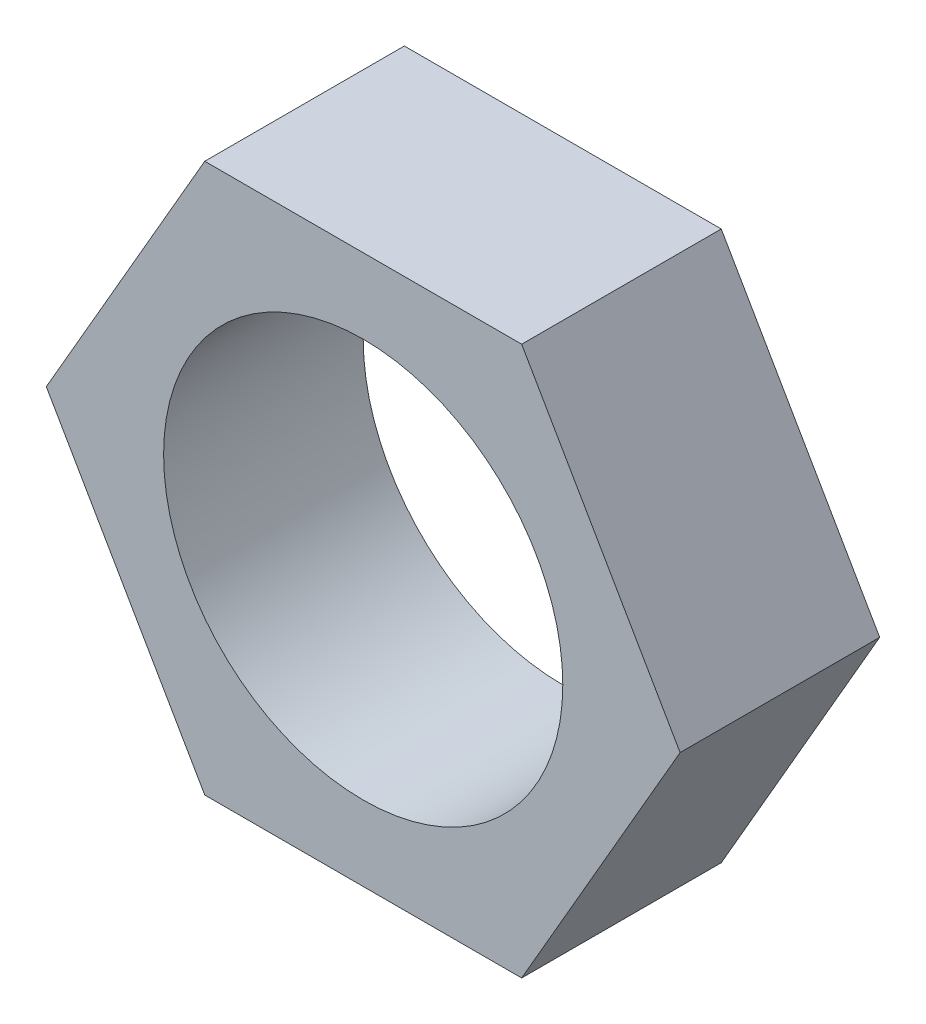
ISO-10303-21;
HEADER;
FILE_DESCRIPTION(('STEP AP214'),'2;1');
FILE_NAME('part.step','',(''),(''),'','','');
FILE_SCHEMA(('AUTOMOTIVE_DESIGN { 1 0 10303 214 1 1 1 1 }'));
ENDSEC;
DATA;
#1=APPLICATION_CONTEXT('core data for automotive mechanical design processes');
#2=APPLICATION_PROTOCOL_DEFINITION('international standard','automotive_design',2000,#1);
#3=PRODUCT_CONTEXT('',#1,'mechanical');
#4=PRODUCT('Part','Part','',(#3));
#5=PRODUCT_RELATED_PRODUCT_CATEGORY('part','',(#4));
#6=PRODUCT_DEFINITION_FORMATION('','',#4);
#7=PRODUCT_DEFINITION_CONTEXT('part definition',#1,'design');
#8=PRODUCT_DEFINITION('design','',#6,#7);
#9=PRODUCT_DEFINITION_SHAPE('','',#8);
#10=(LENGTH_UNIT() NAMED_UNIT(*) SI_UNIT(.MILLI.,.METRE.));
#11=(NAMED_UNIT(*) PLANE_ANGLE_UNIT() SI_UNIT($,.RADIAN.));
#12=(NAMED_UNIT(*) SI_UNIT($,.STERADIAN.) SOLID_ANGLE_UNIT());
#13=UNCERTAINTY_MEASURE_WITH_UNIT(LENGTH_MEASURE(1.E-05),#10,'distance_accuracy_value','');
#14=(GEOMETRIC_REPRESENTATION_CONTEXT(3) GLOBAL_UNCERTAINTY_ASSIGNED_CONTEXT((#13)) GLOBAL_UNIT_ASSIGNED_CONTEXT((#10,
#11,#12)) REPRESENTATION_CONTEXT('',''));
#15=CARTESIAN_POINT('',(0.,0.,0.));
#16=DIRECTION('',(0.,0.,1.));
#17=DIRECTION('',(1.,0.,0.));
#18=AXIS2_PLACEMENT_3D('',#15,#16,#17);
#19=CARTESIAN_POINT('',(4.03279163028953,-6.985,5.08));
#20=DIRECTION('',(-0.866025403784439,0.5,0.));
#21=DIRECTION('',(-0.5,-0.866025403784439,0.));
#22=AXIS2_PLACEMENT_3D('',#19,#20,#21);
#23=PLANE('',#22);
#24=DIRECTION('',(0.5,0.866025403784439,0.));
#25=VECTOR('',#24,1.);
#26=CARTESIAN_POINT('',(4.03279163028953,-6.985,0.));
#27=LINE('',#26,#25);
#28=CARTESIAN_POINT('',(4.03279163028953,-6.985,0.));
#29=VERTEX_POINT('',#28);
#30=CARTESIAN_POINT('',(8.06558326057907,0.,0.));
#31=VERTEX_POINT('',#30);
#32=EDGE_CURVE('E125',#29,#31,#27,.T.);
#33=ORIENTED_EDGE('',*,*,#32,.T.);
#34=DIRECTION('',(0.,0.,-1.));
#35=VECTOR('',#34,1.);
#36=CARTESIAN_POINT('',(8.06558326057907,0.,5.08));
#37=LINE('',#36,#35);
#38=CARTESIAN_POINT('',(8.06558326057907,0.,5.08));
#39=VERTEX_POINT('',#38);
#40=EDGE_CURVE('E11',#39,#31,#37,.T.);
#41=ORIENTED_EDGE('',*,*,#40,.F.);
#42=DIRECTION('',(0.5,0.866025403784439,0.));
#43=VECTOR('',#42,1.);
#44=CARTESIAN_POINT('',(4.03279163028953,-6.985,5.08));
#45=LINE('',#44,#43);
#46=CARTESIAN_POINT('',(4.03279163028953,-6.985,5.08));
#47=VERTEX_POINT('',#46);
#48=EDGE_CURVE('E136',#47,#39,#45,.T.);
#49=ORIENTED_EDGE('',*,*,#48,.F.);
#50=DIRECTION('',(0.,0.,-1.));
#51=VECTOR('',#50,1.);
#52=CARTESIAN_POINT('',(4.03279163028953,-6.985,5.08));
#53=LINE('',#52,#51);
#54=EDGE_CURVE('E121',#47,#29,#53,.T.);
#55=ORIENTED_EDGE('',*,*,#54,.T.);
#56=EDGE_LOOP('',(#33,#41,#49,#55));
#57=FACE_BOUND('',#56,.T.);
#58=ADVANCED_FACE('F41',(#57),#23,.F.);
#59=CARTESIAN_POINT('',(8.06558326057907,0.,5.08));
#60=DIRECTION('',(-0.866025403784439,-0.5,0.));
#61=DIRECTION('',(0.5,-0.866025403784439,0.));
#62=AXIS2_PLACEMENT_3D('',#59,#60,#61);
#63=PLANE('',#62);
#64=DIRECTION('',(-0.5,0.866025403784439,0.));
#65=VECTOR('',#64,1.);
#66=CARTESIAN_POINT('',(8.06558326057907,0.,0.));
#67=LINE('',#66,#65);
#68=CARTESIAN_POINT('',(4.03279163028954,6.985,0.));
#69=VERTEX_POINT('',#68);
#70=EDGE_CURVE('E128',#31,#69,#67,.T.);
#71=ORIENTED_EDGE('',*,*,#70,.T.);
#72=DIRECTION('',(0.,0.,-1.));
#73=VECTOR('',#72,1.);
#74=CARTESIAN_POINT('',(4.03279163028954,6.985,5.08));
#75=LINE('',#74,#73);
#76=CARTESIAN_POINT('',(4.03279163028954,6.985,5.08));
#77=VERTEX_POINT('',#76);
#78=EDGE_CURVE('E49',#77,#69,#75,.T.);
#79=ORIENTED_EDGE('',*,*,#78,.F.);
#80=DIRECTION('',(-0.5,0.866025403784439,0.));
#81=VECTOR('',#80,1.);
#82=CARTESIAN_POINT('',(8.06558326057907,0.,5.08));
#83=LINE('',#82,#81);
#84=EDGE_CURVE('E94',#39,#77,#83,.T.);
#85=ORIENTED_EDGE('',*,*,#84,.F.);
#86=ORIENTED_EDGE('',*,*,#40,.T.);
#87=EDGE_LOOP('',(#71,#79,#85,#86));
#88=FACE_BOUND('',#87,.T.);
#89=ADVANCED_FACE('F161',(#88),#63,.F.);
#90=CARTESIAN_POINT('',(4.03279163028954,6.985,5.08));
#91=DIRECTION('',(0.,-1.,0.));
#92=DIRECTION('',(1.,0.,0.));
#93=AXIS2_PLACEMENT_3D('',#90,#91,#92);
#94=PLANE('',#93);
#95=DIRECTION('',(-1.,0.,0.));
#96=VECTOR('',#95,1.);
#97=CARTESIAN_POINT('',(4.03279163028954,6.985,0.));
#98=LINE('',#97,#96);
#99=CARTESIAN_POINT('',(-4.03279163028953,6.985,0.));
#100=VERTEX_POINT('',#99);
#101=EDGE_CURVE('E131',#69,#100,#98,.T.);
#102=ORIENTED_EDGE('',*,*,#101,.T.);
#103=DIRECTION('',(0.,0.,-1.));
#104=VECTOR('',#103,1.);
#105=CARTESIAN_POINT('',(-4.03279163028953,6.985,5.08));
#106=LINE('',#105,#104);
#107=CARTESIAN_POINT('',(-4.03279163028953,6.985,5.08));
#108=VERTEX_POINT('',#107);
#109=EDGE_CURVE('E116',#108,#100,#106,.T.);
#110=ORIENTED_EDGE('',*,*,#109,.F.);
#111=DIRECTION('',(-1.,0.,0.));
#112=VECTOR('',#111,1.);
#113=CARTESIAN_POINT('',(4.03279163028954,6.985,5.08));
#114=LINE('',#113,#112);
#115=EDGE_CURVE('E107',#77,#108,#114,.T.);
#116=ORIENTED_EDGE('',*,*,#115,.F.);
#117=ORIENTED_EDGE('',*,*,#78,.T.);
#118=EDGE_LOOP('',(#102,#110,#116,#117));
#119=FACE_BOUND('',#118,.T.);
#120=ADVANCED_FACE('F142',(#119),#94,.F.);
#121=CARTESIAN_POINT('',(-4.03279163028953,6.985,5.08));
#122=DIRECTION('',(0.866025403784439,-0.5,0.));
#123=DIRECTION('',(0.5,0.866025403784439,0.));
#124=AXIS2_PLACEMENT_3D('',#121,#122,#123);
#125=PLANE('',#124);
#126=DIRECTION('',(-0.5,-0.866025403784439,0.));
#127=VECTOR('',#126,1.);
#128=CARTESIAN_POINT('',(-4.03279163028953,6.985,0.));
#129=LINE('',#128,#127);
#130=CARTESIAN_POINT('',(-8.06558326057907,0.,0.));
#131=VERTEX_POINT('',#130);
#132=EDGE_CURVE('E115',#100,#131,#129,.T.);
#133=ORIENTED_EDGE('',*,*,#132,.T.);
#134=DIRECTION('',(0.,0.,-1.));
#135=VECTOR('',#134,1.);
#136=CARTESIAN_POINT('',(-8.06558326057907,0.,5.08));
#137=LINE('',#136,#135);
#138=CARTESIAN_POINT('',(-8.06558326057907,0.,5.08));
#139=VERTEX_POINT('',#138);
#140=EDGE_CURVE('E112',#139,#131,#137,.T.);
#141=ORIENTED_EDGE('',*,*,#140,.F.);
#142=DIRECTION('',(-0.5,-0.866025403784439,0.));
#143=VECTOR('',#142,1.);
#144=CARTESIAN_POINT('',(-4.03279163028953,6.985,5.08));
#145=LINE('',#144,#143);
#146=EDGE_CURVE('E101',#108,#139,#145,.T.);
#147=ORIENTED_EDGE('',*,*,#146,.F.);
#148=ORIENTED_EDGE('',*,*,#109,.T.);
#149=EDGE_LOOP('',(#133,#141,#147,#148));
#150=FACE_BOUND('',#149,.T.);
#151=ADVANCED_FACE('F113',(#150),#125,.F.);
#152=CARTESIAN_POINT('',(-8.06558326057907,0.,5.08));
#153=DIRECTION('',(0.866025403784439,0.5,0.));
#154=DIRECTION('',(-0.5,0.866025403784439,0.));
#155=AXIS2_PLACEMENT_3D('',#152,#153,#154);
#156=PLANE('',#155);
#157=DIRECTION('',(0.5,-0.866025403784439,0.));
#158=VECTOR('',#157,1.);
#159=CARTESIAN_POINT('',(-8.06558326057907,0.,0.));
#160=LINE('',#159,#158);
#161=CARTESIAN_POINT('',(-4.03279163028954,-6.985,0.));
#162=VERTEX_POINT('',#161);
#163=EDGE_CURVE('E80',#131,#162,#160,.T.);
#164=ORIENTED_EDGE('',*,*,#163,.T.);
#165=DIRECTION('',(0.,0.,-1.));
#166=VECTOR('',#165,1.);
#167=CARTESIAN_POINT('',(-4.03279163028954,-6.985,5.08));
#168=LINE('',#167,#166);
#169=CARTESIAN_POINT('',(-4.03279163028954,-6.985,5.08));
#170=VERTEX_POINT('',#169);
#171=EDGE_CURVE('E117',#170,#162,#168,.T.);
#172=ORIENTED_EDGE('',*,*,#171,.F.);
#173=DIRECTION('',(0.5,-0.866025403784439,0.));
#174=VECTOR('',#173,1.);
#175=CARTESIAN_POINT('',(-8.06558326057907,0.,5.08));
#176=LINE('',#175,#174);
#177=EDGE_CURVE('E105',#139,#170,#176,.T.);
#178=ORIENTED_EDGE('',*,*,#177,.F.);
#179=ORIENTED_EDGE('',*,*,#140,.T.);
#180=EDGE_LOOP('',(#164,#172,#178,#179));
#181=FACE_BOUND('',#180,.T.);
#182=ADVANCED_FACE('F119',(#181),#156,.F.);
#183=CARTESIAN_POINT('',(-4.03279163028954,-6.985,5.08));
#184=DIRECTION('',(0.,1.,0.));
#185=DIRECTION('',(-1.,0.,0.));
#186=AXIS2_PLACEMENT_3D('',#183,#184,#185);
#187=PLANE('',#186);
#188=DIRECTION('',(1.,0.,0.));
#189=VECTOR('',#188,1.);
#190=CARTESIAN_POINT('',(-4.03279163028954,-6.985,0.));
#191=LINE('',#190,#189);
#192=EDGE_CURVE('E86',#162,#29,#191,.T.);
#193=ORIENTED_EDGE('',*,*,#192,.T.);
#194=ORIENTED_EDGE('',*,*,#54,.F.);
#195=DIRECTION('',(1.,0.,0.));
#196=VECTOR('',#195,1.);
#197=CARTESIAN_POINT('',(-4.03279163028954,-6.985,5.08));
#198=LINE('',#197,#196);
#199=EDGE_CURVE('E57',#170,#47,#198,.T.);
#200=ORIENTED_EDGE('',*,*,#199,.F.);
#201=ORIENTED_EDGE('',*,*,#171,.T.);
#202=EDGE_LOOP('',(#193,#194,#200,#201));
#203=FACE_BOUND('',#202,.T.);
#204=ADVANCED_FACE('F149',(#203),#187,.F.);
#205=CARTESIAN_POINT('',(0.,0.,5.08));
#206=DIRECTION('',(0.,0.,1.));
#207=DIRECTION('',(1.,0.,0.));
#208=AXIS2_PLACEMENT_3D('',#205,#206,#207);
#209=PLANE('',#208);
#210=CARTESIAN_POINT('',(0.,0.,5.08));
#211=DIRECTION('',(0.,0.,1.));
#212=DIRECTION('',(1.,0.,0.));
#213=AXIS2_PLACEMENT_3D('',#210,#211,#212);
#214=CIRCLE('',#213,5.08);
#215=CARTESIAN_POINT('',(5.08,0.,5.08));
#216=VERTEX_POINT('',#215);
#217=EDGE_CURVE('E214',#216,#216,#214,.T.);
#218=ORIENTED_EDGE('',*,*,#217,.F.);
#219=EDGE_LOOP('',(#218));
#220=FACE_BOUND('',#219,.T.);
#221=ORIENTED_EDGE('',*,*,#48,.T.);
#222=ORIENTED_EDGE('',*,*,#84,.T.);
#223=ORIENTED_EDGE('',*,*,#115,.T.);
#224=ORIENTED_EDGE('',*,*,#146,.T.);
#225=ORIENTED_EDGE('',*,*,#177,.T.);
#226=ORIENTED_EDGE('',*,*,#199,.T.);
#227=EDGE_LOOP('',(#221,#222,#223,#224,#225,#226));
#228=FACE_BOUND('',#227,.T.);
#229=ADVANCED_FACE('F103',(#220,#228),#209,.T.);
#230=CARTESIAN_POINT('',(0.,0.,0.));
#231=DIRECTION('',(0.,0.,1.));
#232=DIRECTION('',(1.,0.,0.));
#233=AXIS2_PLACEMENT_3D('',#230,#231,#232);
#234=PLANE('',#233);
#235=CARTESIAN_POINT('',(0.,0.,0.));
#236=DIRECTION('',(0.,0.,1.));
#237=DIRECTION('',(1.,0.,0.));
#238=AXIS2_PLACEMENT_3D('',#235,#236,#237);
#239=CIRCLE('',#238,5.08);
#240=CARTESIAN_POINT('',(5.08,0.,0.));
#241=VERTEX_POINT('',#240);
#242=EDGE_CURVE('E129',#241,#241,#239,.F.);
#243=ORIENTED_EDGE('',*,*,#242,.F.);
#244=EDGE_LOOP('',(#243));
#245=FACE_BOUND('',#244,.T.);
#246=ORIENTED_EDGE('',*,*,#32,.F.);
#247=ORIENTED_EDGE('',*,*,#192,.F.);
#248=ORIENTED_EDGE('',*,*,#163,.F.);
#249=ORIENTED_EDGE('',*,*,#132,.F.);
#250=ORIENTED_EDGE('',*,*,#101,.F.);
#251=ORIENTED_EDGE('',*,*,#70,.F.);
#252=EDGE_LOOP('',(#246,#247,#248,#249,#250,#251));
#253=FACE_BOUND('',#252,.T.);
#254=ADVANCED_FACE('F145',(#245,#253),#234,.F.);
#255=CARTESIAN_POINT('',(0.,0.,-0.00100000000000013));
#256=DIRECTION('',(0.,0.,1.));
#257=DIRECTION('',(1.,0.,0.));
#258=AXIS2_PLACEMENT_3D('',#255,#256,#257);
#259=CYLINDRICAL_SURFACE('',#258,5.08);
#260=ORIENTED_EDGE('',*,*,#217,.T.);
#261=EDGE_LOOP('',(#260));
#262=FACE_BOUND('',#261,.T.);
#263=ORIENTED_EDGE('',*,*,#242,.T.);
#264=EDGE_LOOP('',(#263));
#265=FACE_BOUND('',#264,.T.);
#266=ADVANCED_FACE('F198',(#262,#265),#259,.F.);
#267=CLOSED_SHELL('',(#58,#89,#120,#151,#182,#204,#229,#254,#266));
#268=MANIFOLD_SOLID_BREP('B2',#267);
#269=ADVANCED_BREP_SHAPE_REPRESENTATION('',(#18,#268),#14);
#270=SHAPE_DEFINITION_REPRESENTATION(#9,#269);
ENDSEC;
END-ISO-10303-21;
